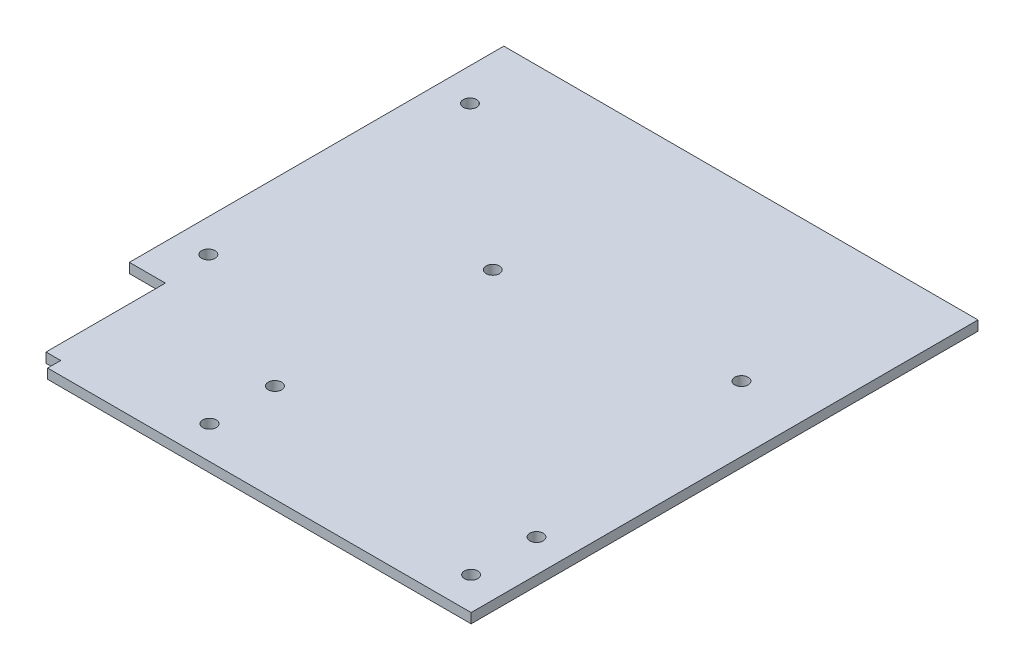
ISO-10303-21;
HEADER;
FILE_DESCRIPTION(('STEP AP214'),'2;1');
FILE_NAME('part.step','',(''),(''),'','','');
FILE_SCHEMA(('AUTOMOTIVE_DESIGN { 1 0 10303 214 1 1 1 1 }'));
ENDSEC;
DATA;
#1=APPLICATION_CONTEXT('core data for automotive mechanical design processes');
#2=APPLICATION_PROTOCOL_DEFINITION('international standard','automotive_design',2000,#1);
#3=PRODUCT_CONTEXT('',#1,'mechanical');
#4=PRODUCT('Part','Part','',(#3));
#5=PRODUCT_RELATED_PRODUCT_CATEGORY('part','',(#4));
#6=PRODUCT_DEFINITION_FORMATION('','',#4);
#7=PRODUCT_DEFINITION_CONTEXT('part definition',#1,'design');
#8=PRODUCT_DEFINITION('design','',#6,#7);
#9=PRODUCT_DEFINITION_SHAPE('','',#8);
#10=(LENGTH_UNIT() NAMED_UNIT(*) SI_UNIT(.MILLI.,.METRE.));
#11=(NAMED_UNIT(*) PLANE_ANGLE_UNIT() SI_UNIT($,.RADIAN.));
#12=(NAMED_UNIT(*) SI_UNIT($,.STERADIAN.) SOLID_ANGLE_UNIT());
#13=UNCERTAINTY_MEASURE_WITH_UNIT(LENGTH_MEASURE(1.E-05),#10,'distance_accuracy_value','');
#14=(GEOMETRIC_REPRESENTATION_CONTEXT(3) GLOBAL_UNCERTAINTY_ASSIGNED_CONTEXT((#13)) GLOBAL_UNIT_ASSIGNED_CONTEXT((#10,
#11,#12)) REPRESENTATION_CONTEXT('',''));
#15=CARTESIAN_POINT('',(0.,0.,0.));
#16=DIRECTION('',(0.,0.,1.));
#17=DIRECTION('',(1.,0.,0.));
#18=AXIS2_PLACEMENT_3D('',#15,#16,#17);
#19=CARTESIAN_POINT('',(-72.5,3.,-77.5));
#20=DIRECTION('',(1.,0.,0.));
#21=DIRECTION('',(0.,0.,-1.));
#22=AXIS2_PLACEMENT_3D('',#19,#20,#21);
#23=PLANE('',#22);
#24=DIRECTION('',(0.,1.,0.));
#25=VECTOR('',#24,1.);
#26=CARTESIAN_POINT('',(-72.5,0.,36.9999999999998));
#27=LINE('',#26,#25);
#28=CARTESIAN_POINT('',(-72.5,0.,36.9999999999998));
#29=VERTEX_POINT('',#28);
#30=CARTESIAN_POINT('',(-72.5,3.,36.9999999999998));
#31=VERTEX_POINT('',#30);
#32=EDGE_CURVE('E62',#29,#31,#27,.T.);
#33=ORIENTED_EDGE('',*,*,#32,.T.);
#34=DIRECTION('',(0.,0.,1.));
#35=VECTOR('',#34,1.);
#36=CARTESIAN_POINT('',(-72.5,3.,-77.5));
#37=LINE('',#36,#35);
#38=CARTESIAN_POINT('',(-72.5,3.,-77.5));
#39=VERTEX_POINT('',#38);
#40=EDGE_CURVE('E175',#39,#31,#37,.T.);
#41=ORIENTED_EDGE('',*,*,#40,.F.);
#42=DIRECTION('',(0.,-1.,0.));
#43=VECTOR('',#42,1.);
#44=CARTESIAN_POINT('',(-72.5,3.,-77.5));
#45=LINE('',#44,#43);
#46=CARTESIAN_POINT('',(-72.5,0.,-77.5));
#47=VERTEX_POINT('',#46);
#48=EDGE_CURVE('E239',#39,#47,#45,.T.);
#49=ORIENTED_EDGE('',*,*,#48,.T.);
#50=DIRECTION('',(0.,0.,1.));
#51=VECTOR('',#50,1.);
#52=CARTESIAN_POINT('',(-72.5,0.,-77.5));
#53=LINE('',#52,#51);
#54=EDGE_CURVE('E195',#47,#29,#53,.T.);
#55=ORIENTED_EDGE('',*,*,#54,.T.);
#56=EDGE_LOOP('',(#33,#41,#49,#55));
#57=FACE_BOUND('',#56,.T.);
#58=ADVANCED_FACE('F45',(#57),#23,.F.);
#59=CARTESIAN_POINT('',(72.5,3.,77.5));
#60=DIRECTION('',(0.,0.,-1.));
#61=DIRECTION('',(-1.,0.,0.));
#62=AXIS2_PLACEMENT_3D('',#59,#60,#61);
#63=PLANE('',#62);
#64=DIRECTION('',(1.,0.,0.));
#65=VECTOR('',#64,1.);
#66=CARTESIAN_POINT('',(72.5,3.,77.5));
#67=LINE('',#66,#65);
#68=CARTESIAN_POINT('',(-57.0000000000001,3.,77.5));
#69=VERTEX_POINT('',#68);
#70=CARTESIAN_POINT('',(72.5,3.,77.5));
#71=VERTEX_POINT('',#70);
#72=EDGE_CURVE('E93',#69,#71,#67,.T.);
#73=ORIENTED_EDGE('',*,*,#72,.F.);
#74=DIRECTION('',(0.,1.,0.));
#75=VECTOR('',#74,1.);
#76=CARTESIAN_POINT('',(-57.0000000000001,0.,77.5));
#77=LINE('',#76,#75);
#78=CARTESIAN_POINT('',(-57.0000000000001,0.,77.5));
#79=VERTEX_POINT('',#78);
#80=EDGE_CURVE('E199',#79,#69,#77,.T.);
#81=ORIENTED_EDGE('',*,*,#80,.F.);
#82=DIRECTION('',(1.,0.,0.));
#83=VECTOR('',#82,1.);
#84=CARTESIAN_POINT('',(72.5,0.,77.5));
#85=LINE('',#84,#83);
#86=CARTESIAN_POINT('',(72.5,0.,77.5));
#87=VERTEX_POINT('',#86);
#88=EDGE_CURVE('E243',#79,#87,#85,.T.);
#89=ORIENTED_EDGE('',*,*,#88,.T.);
#90=DIRECTION('',(0.,-1.,0.));
#91=VECTOR('',#90,1.);
#92=CARTESIAN_POINT('',(72.5,3.,77.5));
#93=LINE('',#92,#91);
#94=EDGE_CURVE('E12',#71,#87,#93,.T.);
#95=ORIENTED_EDGE('',*,*,#94,.F.);
#96=EDGE_LOOP('',(#73,#81,#89,#95));
#97=FACE_BOUND('',#96,.T.);
#98=ADVANCED_FACE('F336',(#97),#63,.F.);
#99=CARTESIAN_POINT('',(72.5,3.,-77.5));
#100=DIRECTION('',(-1.,0.,0.));
#101=DIRECTION('',(0.,0.,1.));
#102=AXIS2_PLACEMENT_3D('',#99,#100,#101);
#103=PLANE('',#102);
#104=DIRECTION('',(0.,0.,-1.));
#105=VECTOR('',#104,1.);
#106=CARTESIAN_POINT('',(72.5,0.,-77.5));
#107=LINE('',#106,#105);
#108=CARTESIAN_POINT('',(72.5,0.,-77.5));
#109=VERTEX_POINT('',#108);
#110=EDGE_CURVE('E241',#87,#109,#107,.T.);
#111=ORIENTED_EDGE('',*,*,#110,.T.);
#112=DIRECTION('',(0.,-1.,0.));
#113=VECTOR('',#112,1.);
#114=CARTESIAN_POINT('',(72.5,3.,-77.5));
#115=LINE('',#114,#113);
#116=CARTESIAN_POINT('',(72.5,3.,-77.5));
#117=VERTEX_POINT('',#116);
#118=EDGE_CURVE('E54',#117,#109,#115,.T.);
#119=ORIENTED_EDGE('',*,*,#118,.F.);
#120=DIRECTION('',(0.,0.,-1.));
#121=VECTOR('',#120,1.);
#122=CARTESIAN_POINT('',(72.5,3.,-77.5));
#123=LINE('',#122,#121);
#124=EDGE_CURVE('E183',#71,#117,#123,.T.);
#125=ORIENTED_EDGE('',*,*,#124,.F.);
#126=ORIENTED_EDGE('',*,*,#94,.T.);
#127=EDGE_LOOP('',(#111,#119,#125,#126));
#128=FACE_BOUND('',#127,.T.);
#129=ADVANCED_FACE('F340',(#128),#103,.F.);
#130=CARTESIAN_POINT('',(72.5,3.,-77.5));
#131=DIRECTION('',(0.,0.,1.));
#132=DIRECTION('',(1.,0.,0.));
#133=AXIS2_PLACEMENT_3D('',#130,#131,#132);
#134=PLANE('',#133);
#135=DIRECTION('',(-1.,0.,0.));
#136=VECTOR('',#135,1.);
#137=CARTESIAN_POINT('',(72.5,0.,-77.5));
#138=LINE('',#137,#136);
#139=EDGE_CURVE('E88',#109,#47,#138,.T.);
#140=ORIENTED_EDGE('',*,*,#139,.T.);
#141=ORIENTED_EDGE('',*,*,#48,.F.);
#142=DIRECTION('',(-1.,0.,0.));
#143=VECTOR('',#142,1.);
#144=CARTESIAN_POINT('',(72.5,3.,-77.5));
#145=LINE('',#144,#143);
#146=EDGE_CURVE('E71',#117,#39,#145,.T.);
#147=ORIENTED_EDGE('',*,*,#146,.F.);
#148=ORIENTED_EDGE('',*,*,#118,.T.);
#149=EDGE_LOOP('',(#140,#141,#147,#148));
#150=FACE_BOUND('',#149,.T.);
#151=ADVANCED_FACE('F311',(#150),#134,.F.);
#152=CARTESIAN_POINT('',(0.,3.,0.));
#153=DIRECTION('',(0.,-1.,0.));
#154=DIRECTION('',(0.,0.,-1.));
#155=AXIS2_PLACEMENT_3D('',#152,#153,#154);
#156=PLANE('',#155);
#157=CARTESIAN_POINT('',(52.5382872677798,3.,-25.1288519240478));
#158=DIRECTION('',(0.,1.,0.));
#159=DIRECTION('',(0.,0.,1.));
#160=AXIS2_PLACEMENT_3D('',#157,#158,#159);
#161=CIRCLE('',#160,2.04999999999999);
#162=CARTESIAN_POINT('',(52.5382872677798,3.,-23.0788519240478));
#163=VERTEX_POINT('',#162);
#164=EDGE_CURVE('E226',#163,#163,#161,.T.);
#165=ORIENTED_EDGE('',*,*,#164,.F.);
#166=EDGE_LOOP('',(#165));
#167=FACE_BOUND('',#166,.T.);
#168=CARTESIAN_POINT('',(-14.9550989801013,3.,-16.5759468915573));
#169=DIRECTION('',(0.,1.,0.));
#170=DIRECTION('',(0.,0.,1.));
#171=AXIS2_PLACEMENT_3D('',#168,#169,#170);
#172=CIRCLE('',#171,2.05);
#173=CARTESIAN_POINT('',(-14.9550989801013,3.,-14.5259468915573));
#174=VERTEX_POINT('',#173);
#175=EDGE_CURVE('E224',#174,#174,#172,.T.);
#176=ORIENTED_EDGE('',*,*,#175,.F.);
#177=EDGE_LOOP('',(#176));
#178=FACE_BOUND('',#177,.T.);
#179=CARTESIAN_POINT('',(62.5000000000001,3.,47.5));
#180=DIRECTION('',(0.,1.,0.));
#181=DIRECTION('',(0.,0.,1.));
#182=AXIS2_PLACEMENT_3D('',#179,#180,#181);
#183=CIRCLE('',#182,2.05000000000001);
#184=CARTESIAN_POINT('',(62.5000000000001,3.,49.55));
#185=VERTEX_POINT('',#184);
#186=EDGE_CURVE('E219',#185,#185,#183,.T.);
#187=ORIENTED_EDGE('',*,*,#186,.F.);
#188=EDGE_LOOP('',(#187));
#189=FACE_BOUND('',#188,.T.);
#190=CARTESIAN_POINT('',(-17.4999999999998,3.,67.5000000000005));
#191=DIRECTION('',(0.,1.,0.));
#192=DIRECTION('',(0.,0.,1.));
#193=AXIS2_PLACEMENT_3D('',#190,#191,#192);
#194=CIRCLE('',#193,2.05000000000001);
#195=CARTESIAN_POINT('',(-17.4999999999998,3.,69.5500000000005));
#196=VERTEX_POINT('',#195);
#197=EDGE_CURVE('E218',#196,#196,#194,.T.);
#198=ORIENTED_EDGE('',*,*,#197,.F.);
#199=EDGE_LOOP('',(#198));
#200=FACE_BOUND('',#199,.T.);
#201=CARTESIAN_POINT('',(-17.4999999999999,3.,47.5000000000005));
#202=DIRECTION('',(0.,1.,0.));
#203=DIRECTION('',(0.,0.,1.));
#204=AXIS2_PLACEMENT_3D('',#201,#202,#203);
#205=CIRCLE('',#204,2.05000000000001);
#206=CARTESIAN_POINT('',(-17.4999999999999,3.,49.5500000000005));
#207=VERTEX_POINT('',#206);
#208=EDGE_CURVE('E232',#207,#207,#205,.T.);
#209=ORIENTED_EDGE('',*,*,#208,.F.);
#210=EDGE_LOOP('',(#209));
#211=FACE_BOUND('',#210,.T.);
#212=CARTESIAN_POINT('',(-62.5,3.,-57.1500000000002));
#213=DIRECTION('',(0.,1.,0.));
#214=DIRECTION('',(0.,0.,1.));
#215=AXIS2_PLACEMENT_3D('',#212,#213,#214);
#216=CIRCLE('',#215,2.04999999999999);
#217=CARTESIAN_POINT('',(-62.5,3.,-55.1000000000002));
#218=VERTEX_POINT('',#217);
#219=EDGE_CURVE('E246',#218,#218,#216,.T.);
#220=ORIENTED_EDGE('',*,*,#219,.F.);
#221=EDGE_LOOP('',(#220));
#222=FACE_BOUND('',#221,.T.);
#223=CARTESIAN_POINT('',(-62.4999999999997,3.,22.8499999999998));
#224=DIRECTION('',(0.,1.,0.));
#225=DIRECTION('',(0.,0.,1.));
#226=AXIS2_PLACEMENT_3D('',#223,#224,#225);
#227=CIRCLE('',#226,2.04999999999999);
#228=CARTESIAN_POINT('',(-62.4999999999997,3.,24.8999999999998));
#229=VERTEX_POINT('',#228);
#230=EDGE_CURVE('E223',#229,#229,#227,.T.);
#231=ORIENTED_EDGE('',*,*,#230,.F.);
#232=EDGE_LOOP('',(#231));
#233=FACE_BOUND('',#232,.T.);
#234=CARTESIAN_POINT('',(62.5000000000002,3.,67.5));
#235=DIRECTION('',(0.,1.,0.));
#236=DIRECTION('',(0.,0.,1.));
#237=AXIS2_PLACEMENT_3D('',#234,#235,#236);
#238=CIRCLE('',#237,2.05000000000001);
#239=CARTESIAN_POINT('',(62.5000000000002,3.,69.55));
#240=VERTEX_POINT('',#239);
#241=EDGE_CURVE('E155',#240,#240,#238,.T.);
#242=ORIENTED_EDGE('',*,*,#241,.F.);
#243=EDGE_LOOP('',(#242));
#244=FACE_BOUND('',#243,.T.);
#245=DIRECTION('',(1.,0.,0.));
#246=VECTOR('',#245,1.);
#247=CARTESIAN_POINT('',(0.,3.,73.5));
#248=LINE('',#247,#246);
#249=CARTESIAN_POINT('',(-61.5000000000001,3.,73.5));
#250=VERTEX_POINT('',#249);
#251=CARTESIAN_POINT('',(-57.0000000000001,3.,73.5));
#252=VERTEX_POINT('',#251);
#253=EDGE_CURVE('E146',#250,#252,#248,.T.);
#254=ORIENTED_EDGE('',*,*,#253,.T.);
#255=DIRECTION('',(0.,0.,-1.));
#256=VECTOR('',#255,1.);
#257=CARTESIAN_POINT('',(-57.0000000000001,3.,0.));
#258=LINE('',#257,#256);
#259=EDGE_CURVE('E152',#69,#252,#258,.T.);
#260=ORIENTED_EDGE('',*,*,#259,.F.);
#261=ORIENTED_EDGE('',*,*,#72,.T.);
#262=ORIENTED_EDGE('',*,*,#124,.T.);
#263=ORIENTED_EDGE('',*,*,#146,.T.);
#264=ORIENTED_EDGE('',*,*,#40,.T.);
#265=DIRECTION('',(1.,0.,0.));
#266=VECTOR('',#265,1.);
#267=CARTESIAN_POINT('',(0.,3.,36.9999999999998));
#268=LINE('',#267,#266);
#269=CARTESIAN_POINT('',(-61.5000000000001,3.,36.9999999999998));
#270=VERTEX_POINT('',#269);
#271=EDGE_CURVE('E164',#31,#270,#268,.T.);
#272=ORIENTED_EDGE('',*,*,#271,.T.);
#273=DIRECTION('',(0.,0.,1.));
#274=VECTOR('',#273,1.);
#275=CARTESIAN_POINT('',(-61.5000000000001,3.,0.));
#276=LINE('',#275,#274);
#277=EDGE_CURVE('E137',#270,#250,#276,.T.);
#278=ORIENTED_EDGE('',*,*,#277,.T.);
#279=EDGE_LOOP('',(#254,#260,#261,#262,#263,#264,#272,#278));
#280=FACE_BOUND('',#279,.T.);
#281=ADVANCED_FACE('F205',(#167,#178,#189,#200,#211,#222,#233,#244,#280),#156,.F.);
#282=CARTESIAN_POINT('',(0.,0.,0.));
#283=DIRECTION('',(0.,-1.,0.));
#284=DIRECTION('',(0.,0.,-1.));
#285=AXIS2_PLACEMENT_3D('',#282,#283,#284);
#286=PLANE('',#285);
#287=CARTESIAN_POINT('',(52.5382872677798,0.,-25.1288519240478));
#288=DIRECTION('',(0.,-1.,0.));
#289=DIRECTION('',(0.,0.,-1.));
#290=AXIS2_PLACEMENT_3D('',#287,#288,#289);
#291=CIRCLE('',#290,2.04999999999999);
#292=CARTESIAN_POINT('',(52.5382872677798,0.,-27.1788519240478));
#293=VERTEX_POINT('',#292);
#294=EDGE_CURVE('E48',#293,#293,#291,.T.);
#295=ORIENTED_EDGE('',*,*,#294,.F.);
#296=EDGE_LOOP('',(#295));
#297=FACE_BOUND('',#296,.T.);
#298=CARTESIAN_POINT('',(-14.9550989801013,0.,-16.5759468915573));
#299=DIRECTION('',(0.,-1.,0.));
#300=DIRECTION('',(0.,0.,-1.));
#301=AXIS2_PLACEMENT_3D('',#298,#299,#300);
#302=CIRCLE('',#301,2.05);
#303=CARTESIAN_POINT('',(-14.9550989801013,0.,-18.6259468915573));
#304=VERTEX_POINT('',#303);
#305=EDGE_CURVE('E229',#304,#304,#302,.T.);
#306=ORIENTED_EDGE('',*,*,#305,.F.);
#307=EDGE_LOOP('',(#306));
#308=FACE_BOUND('',#307,.T.);
#309=CARTESIAN_POINT('',(62.5000000000001,0.,47.5));
#310=DIRECTION('',(0.,1.,0.));
#311=DIRECTION('',(0.,0.,1.));
#312=AXIS2_PLACEMENT_3D('',#309,#310,#311);
#313=CIRCLE('',#312,2.05000000000001);
#314=CARTESIAN_POINT('',(62.5000000000001,0.,49.55));
#315=VERTEX_POINT('',#314);
#316=EDGE_CURVE('E257',#315,#315,#313,.T.);
#317=ORIENTED_EDGE('',*,*,#316,.T.);
#318=EDGE_LOOP('',(#317));
#319=FACE_BOUND('',#318,.T.);
#320=CARTESIAN_POINT('',(-17.4999999999998,0.,67.5000000000005));
#321=DIRECTION('',(0.,1.,0.));
#322=DIRECTION('',(0.,0.,1.));
#323=AXIS2_PLACEMENT_3D('',#320,#321,#322);
#324=CIRCLE('',#323,2.05000000000001);
#325=CARTESIAN_POINT('',(-17.4999999999998,0.,69.5500000000005));
#326=VERTEX_POINT('',#325);
#327=EDGE_CURVE('E215',#326,#326,#324,.T.);
#328=ORIENTED_EDGE('',*,*,#327,.T.);
#329=EDGE_LOOP('',(#328));
#330=FACE_BOUND('',#329,.T.);
#331=CARTESIAN_POINT('',(-17.4999999999999,0.,47.5000000000005));
#332=DIRECTION('',(0.,1.,0.));
#333=DIRECTION('',(0.,0.,1.));
#334=AXIS2_PLACEMENT_3D('',#331,#332,#333);
#335=CIRCLE('',#334,2.05000000000001);
#336=CARTESIAN_POINT('',(-17.4999999999999,0.,49.5500000000005));
#337=VERTEX_POINT('',#336);
#338=EDGE_CURVE('E236',#337,#337,#335,.T.);
#339=ORIENTED_EDGE('',*,*,#338,.T.);
#340=EDGE_LOOP('',(#339));
#341=FACE_BOUND('',#340,.T.);
#342=CARTESIAN_POINT('',(-62.5,0.,-57.1500000000002));
#343=DIRECTION('',(0.,1.,0.));
#344=DIRECTION('',(0.,0.,1.));
#345=AXIS2_PLACEMENT_3D('',#342,#343,#344);
#346=CIRCLE('',#345,2.04999999999999);
#347=CARTESIAN_POINT('',(-62.5,0.,-55.1000000000002));
#348=VERTEX_POINT('',#347);
#349=EDGE_CURVE('E235',#348,#348,#346,.T.);
#350=ORIENTED_EDGE('',*,*,#349,.T.);
#351=EDGE_LOOP('',(#350));
#352=FACE_BOUND('',#351,.T.);
#353=CARTESIAN_POINT('',(-62.4999999999997,0.,22.8499999999998));
#354=DIRECTION('',(0.,1.,0.));
#355=DIRECTION('',(0.,0.,1.));
#356=AXIS2_PLACEMENT_3D('',#353,#354,#355);
#357=CIRCLE('',#356,2.04999999999999);
#358=CARTESIAN_POINT('',(-62.4999999999997,0.,24.8999999999998));
#359=VERTEX_POINT('',#358);
#360=EDGE_CURVE('E249',#359,#359,#357,.T.);
#361=ORIENTED_EDGE('',*,*,#360,.T.);
#362=EDGE_LOOP('',(#361));
#363=FACE_BOUND('',#362,.T.);
#364=CARTESIAN_POINT('',(62.5000000000002,0.,67.5));
#365=DIRECTION('',(0.,1.,0.));
#366=DIRECTION('',(0.,0.,1.));
#367=AXIS2_PLACEMENT_3D('',#364,#365,#366);
#368=CIRCLE('',#367,2.05000000000001);
#369=CARTESIAN_POINT('',(62.5000000000002,0.,69.55));
#370=VERTEX_POINT('',#369);
#371=EDGE_CURVE('E165',#370,#370,#368,.T.);
#372=ORIENTED_EDGE('',*,*,#371,.T.);
#373=EDGE_LOOP('',(#372));
#374=FACE_BOUND('',#373,.T.);
#375=DIRECTION('',(0.,0.,-1.));
#376=VECTOR('',#375,1.);
#377=CARTESIAN_POINT('',(-57.0000000000001,0.,0.));
#378=LINE('',#377,#376);
#379=CARTESIAN_POINT('',(-57.0000000000001,0.,73.5));
#380=VERTEX_POINT('',#379);
#381=EDGE_CURVE('E129',#79,#380,#378,.T.);
#382=ORIENTED_EDGE('',*,*,#381,.T.);
#383=DIRECTION('',(1.,0.,0.));
#384=VECTOR('',#383,1.);
#385=CARTESIAN_POINT('',(0.,0.,73.5));
#386=LINE('',#385,#384);
#387=CARTESIAN_POINT('',(-61.5000000000001,0.,73.5));
#388=VERTEX_POINT('',#387);
#389=EDGE_CURVE('E140',#388,#380,#386,.T.);
#390=ORIENTED_EDGE('',*,*,#389,.F.);
#391=DIRECTION('',(0.,0.,1.));
#392=VECTOR('',#391,1.);
#393=CARTESIAN_POINT('',(-61.5000000000001,0.,0.));
#394=LINE('',#393,#392);
#395=CARTESIAN_POINT('',(-61.5000000000001,0.,36.9999999999998));
#396=VERTEX_POINT('',#395);
#397=EDGE_CURVE('E130',#396,#388,#394,.T.);
#398=ORIENTED_EDGE('',*,*,#397,.F.);
#399=DIRECTION('',(1.,0.,0.));
#400=VECTOR('',#399,1.);
#401=CARTESIAN_POINT('',(0.,0.,36.9999999999998));
#402=LINE('',#401,#400);
#403=EDGE_CURVE('E119',#29,#396,#402,.T.);
#404=ORIENTED_EDGE('',*,*,#403,.F.);
#405=ORIENTED_EDGE('',*,*,#54,.F.);
#406=ORIENTED_EDGE('',*,*,#139,.F.);
#407=ORIENTED_EDGE('',*,*,#110,.F.);
#408=ORIENTED_EDGE('',*,*,#88,.F.);
#409=EDGE_LOOP('',(#382,#390,#398,#404,#405,#406,#407,#408));
#410=FACE_BOUND('',#409,.T.);
#411=ADVANCED_FACE('F144',(#297,#308,#319,#330,#341,#352,#363,#374,#410),#286,.T.);
#412=CARTESIAN_POINT('',(-61.5000000000001,0.,0.));
#413=DIRECTION('',(-1.,0.,0.));
#414=DIRECTION('',(0.,0.,1.));
#415=AXIS2_PLACEMENT_3D('',#412,#413,#414);
#416=PLANE('',#415);
#417=ORIENTED_EDGE('',*,*,#277,.F.);
#418=DIRECTION('',(0.,1.,0.));
#419=VECTOR('',#418,1.);
#420=CARTESIAN_POINT('',(-61.5000000000001,0.,36.9999999999998));
#421=LINE('',#420,#419);
#422=EDGE_CURVE('E122',#396,#270,#421,.T.);
#423=ORIENTED_EDGE('',*,*,#422,.F.);
#424=ORIENTED_EDGE('',*,*,#397,.T.);
#425=DIRECTION('',(0.,1.,0.));
#426=VECTOR('',#425,1.);
#427=CARTESIAN_POINT('',(-61.5000000000001,0.,73.5));
#428=LINE('',#427,#426);
#429=EDGE_CURVE('E192',#388,#250,#428,.T.);
#430=ORIENTED_EDGE('',*,*,#429,.T.);
#431=EDGE_LOOP('',(#417,#423,#424,#430));
#432=FACE_BOUND('',#431,.T.);
#433=ADVANCED_FACE('F133',(#432),#416,.T.);
#434=CARTESIAN_POINT('',(0.,0.,73.5));
#435=DIRECTION('',(0.,0.,1.));
#436=DIRECTION('',(1.,0.,0.));
#437=AXIS2_PLACEMENT_3D('',#434,#435,#436);
#438=PLANE('',#437);
#439=ORIENTED_EDGE('',*,*,#253,.F.);
#440=ORIENTED_EDGE('',*,*,#429,.F.);
#441=ORIENTED_EDGE('',*,*,#389,.T.);
#442=DIRECTION('',(0.,1.,0.));
#443=VECTOR('',#442,1.);
#444=CARTESIAN_POINT('',(-57.0000000000001,0.,73.5));
#445=LINE('',#444,#443);
#446=EDGE_CURVE('E196',#380,#252,#445,.T.);
#447=ORIENTED_EDGE('',*,*,#446,.T.);
#448=EDGE_LOOP('',(#439,#440,#441,#447));
#449=FACE_BOUND('',#448,.T.);
#450=ADVANCED_FACE('F208',(#449),#438,.T.);
#451=CARTESIAN_POINT('',(-57.0000000000001,0.,0.));
#452=DIRECTION('',(1.,0.,0.));
#453=DIRECTION('',(0.,0.,-1.));
#454=AXIS2_PLACEMENT_3D('',#451,#452,#453);
#455=PLANE('',#454);
#456=ORIENTED_EDGE('',*,*,#259,.T.);
#457=ORIENTED_EDGE('',*,*,#446,.F.);
#458=ORIENTED_EDGE('',*,*,#381,.F.);
#459=ORIENTED_EDGE('',*,*,#80,.T.);
#460=EDGE_LOOP('',(#456,#457,#458,#459));
#461=FACE_BOUND('',#460,.T.);
#462=ADVANCED_FACE('F211',(#461),#455,.F.);
#463=CARTESIAN_POINT('',(0.,0.,36.9999999999998));
#464=DIRECTION('',(0.,0.,1.));
#465=DIRECTION('',(1.,0.,0.));
#466=AXIS2_PLACEMENT_3D('',#463,#464,#465);
#467=PLANE('',#466);
#468=ORIENTED_EDGE('',*,*,#271,.F.);
#469=ORIENTED_EDGE('',*,*,#32,.F.);
#470=ORIENTED_EDGE('',*,*,#403,.T.);
#471=ORIENTED_EDGE('',*,*,#422,.T.);
#472=EDGE_LOOP('',(#468,#469,#470,#471));
#473=FACE_BOUND('',#472,.T.);
#474=ADVANCED_FACE('F121',(#473),#467,.T.);
#475=CARTESIAN_POINT('',(62.5000000000002,0.,67.5));
#476=DIRECTION('',(0.,1.,0.));
#477=DIRECTION('',(0.,0.,1.));
#478=AXIS2_PLACEMENT_3D('',#475,#476,#477);
#479=CYLINDRICAL_SURFACE('',#478,2.05000000000001);
#480=ORIENTED_EDGE('',*,*,#371,.F.);
#481=EDGE_LOOP('',(#480));
#482=FACE_BOUND('',#481,.T.);
#483=ORIENTED_EDGE('',*,*,#241,.T.);
#484=EDGE_LOOP('',(#483));
#485=FACE_BOUND('',#484,.T.);
#486=ADVANCED_FACE('F320',(#482,#485),#479,.F.);
#487=CARTESIAN_POINT('',(-62.4999999999997,0.,22.8499999999998));
#488=DIRECTION('',(0.,1.,0.));
#489=DIRECTION('',(0.,0.,1.));
#490=AXIS2_PLACEMENT_3D('',#487,#488,#489);
#491=CYLINDRICAL_SURFACE('',#490,2.04999999999999);
#492=ORIENTED_EDGE('',*,*,#360,.F.);
#493=EDGE_LOOP('',(#492));
#494=FACE_BOUND('',#493,.T.);
#495=ORIENTED_EDGE('',*,*,#230,.T.);
#496=EDGE_LOOP('',(#495));
#497=FACE_BOUND('',#496,.T.);
#498=ADVANCED_FACE('F322',(#494,#497),#491,.F.);
#499=CARTESIAN_POINT('',(-62.5,0.,-57.1500000000002));
#500=DIRECTION('',(0.,1.,0.));
#501=DIRECTION('',(0.,0.,1.));
#502=AXIS2_PLACEMENT_3D('',#499,#500,#501);
#503=CYLINDRICAL_SURFACE('',#502,2.04999999999999);
#504=ORIENTED_EDGE('',*,*,#349,.F.);
#505=EDGE_LOOP('',(#504));
#506=FACE_BOUND('',#505,.T.);
#507=ORIENTED_EDGE('',*,*,#219,.T.);
#508=EDGE_LOOP('',(#507));
#509=FACE_BOUND('',#508,.T.);
#510=ADVANCED_FACE('F305',(#506,#509),#503,.F.);
#511=CARTESIAN_POINT('',(-17.4999999999999,0.,47.5000000000005));
#512=DIRECTION('',(0.,1.,0.));
#513=DIRECTION('',(0.,0.,1.));
#514=AXIS2_PLACEMENT_3D('',#511,#512,#513);
#515=CYLINDRICAL_SURFACE('',#514,2.05000000000001);
#516=ORIENTED_EDGE('',*,*,#338,.F.);
#517=EDGE_LOOP('',(#516));
#518=FACE_BOUND('',#517,.T.);
#519=ORIENTED_EDGE('',*,*,#208,.T.);
#520=EDGE_LOOP('',(#519));
#521=FACE_BOUND('',#520,.T.);
#522=ADVANCED_FACE('F301',(#518,#521),#515,.F.);
#523=CARTESIAN_POINT('',(-17.4999999999998,0.,67.5000000000005));
#524=DIRECTION('',(0.,1.,0.));
#525=DIRECTION('',(0.,0.,1.));
#526=AXIS2_PLACEMENT_3D('',#523,#524,#525);
#527=CYLINDRICAL_SURFACE('',#526,2.05000000000001);
#528=ORIENTED_EDGE('',*,*,#327,.F.);
#529=EDGE_LOOP('',(#528));
#530=FACE_BOUND('',#529,.T.);
#531=ORIENTED_EDGE('',*,*,#197,.T.);
#532=EDGE_LOOP('',(#531));
#533=FACE_BOUND('',#532,.T.);
#534=ADVANCED_FACE('F304',(#530,#533),#527,.F.);
#535=CARTESIAN_POINT('',(62.5000000000001,0.,47.5));
#536=DIRECTION('',(0.,1.,0.));
#537=DIRECTION('',(0.,0.,1.));
#538=AXIS2_PLACEMENT_3D('',#535,#536,#537);
#539=CYLINDRICAL_SURFACE('',#538,2.05000000000001);
#540=ORIENTED_EDGE('',*,*,#316,.F.);
#541=EDGE_LOOP('',(#540));
#542=FACE_BOUND('',#541,.T.);
#543=ORIENTED_EDGE('',*,*,#186,.T.);
#544=EDGE_LOOP('',(#543));
#545=FACE_BOUND('',#544,.T.);
#546=ADVANCED_FACE('F395',(#542,#545),#539,.F.);
#547=CARTESIAN_POINT('',(-14.9550989801013,-7.,-16.5759468915573));
#548=DIRECTION('',(0.,1.,0.));
#549=DIRECTION('',(0.,0.,1.));
#550=AXIS2_PLACEMENT_3D('',#547,#548,#549);
#551=CYLINDRICAL_SURFACE('',#550,2.05);
#552=ORIENTED_EDGE('',*,*,#305,.T.);
#553=EDGE_LOOP('',(#552));
#554=FACE_BOUND('',#553,.T.);
#555=ORIENTED_EDGE('',*,*,#175,.T.);
#556=EDGE_LOOP('',(#555));
#557=FACE_BOUND('',#556,.T.);
#558=ADVANCED_FACE('F404',(#554,#557),#551,.F.);
#559=CARTESIAN_POINT('',(52.5382872677798,-7.,-25.1288519240478));
#560=DIRECTION('',(0.,1.,0.));
#561=DIRECTION('',(0.,0.,1.));
#562=AXIS2_PLACEMENT_3D('',#559,#560,#561);
#563=CYLINDRICAL_SURFACE('',#562,2.04999999999999);
#564=ORIENTED_EDGE('',*,*,#294,.T.);
#565=EDGE_LOOP('',(#564));
#566=FACE_BOUND('',#565,.T.);
#567=ORIENTED_EDGE('',*,*,#164,.T.);
#568=EDGE_LOOP('',(#567));
#569=FACE_BOUND('',#568,.T.);
#570=ADVANCED_FACE('F413',(#566,#569),#563,.F.);
#571=CLOSED_SHELL('',(#58,#98,#129,#151,#281,#411,#433,#450,#462,#474,#486,#498,#510,#522,#534,
#546,#558,#570));
#572=MANIFOLD_SOLID_BREP('B2',#571);
#573=ADVANCED_BREP_SHAPE_REPRESENTATION('',(#18,#572),#14);
#574=SHAPE_DEFINITION_REPRESENTATION(#9,#573);
ENDSEC;
END-ISO-10303-21;
